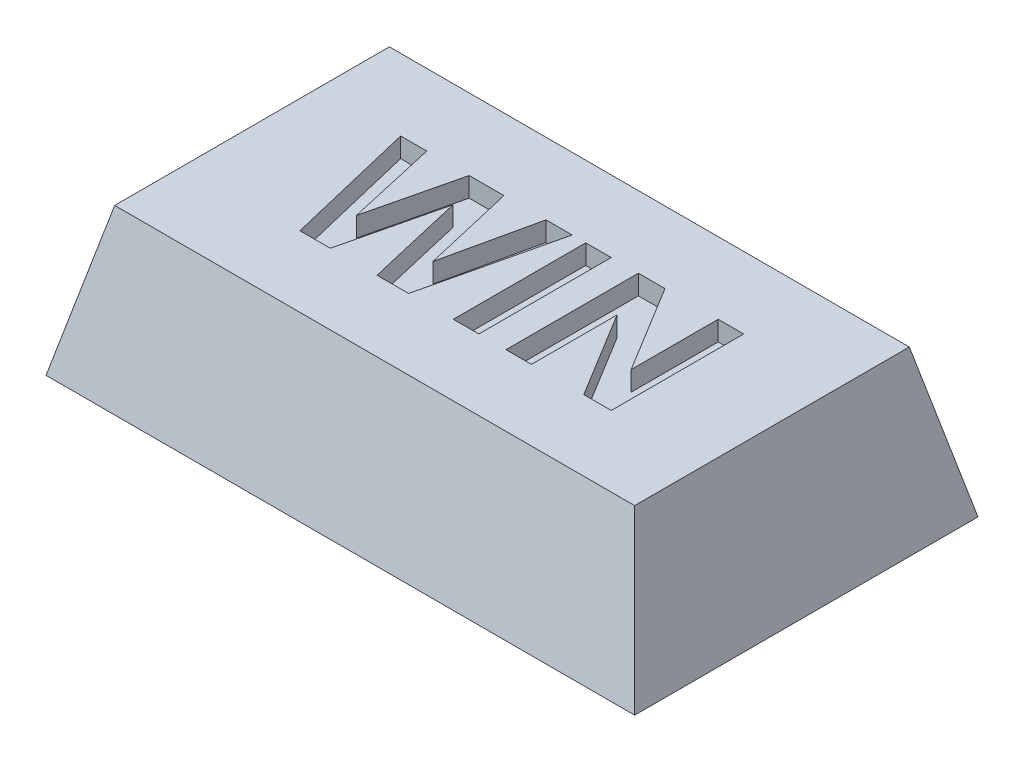
ISO-10303-21;
HEADER;
FILE_DESCRIPTION(('STEP AP214'),'2;1');
FILE_NAME('part.step','',(''),(''),'','','');
FILE_SCHEMA(('AUTOMOTIVE_DESIGN { 1 0 10303 214 1 1 1 1 }'));
ENDSEC;
DATA;
#1=APPLICATION_CONTEXT('core data for automotive mechanical design processes');
#2=APPLICATION_PROTOCOL_DEFINITION('international standard','automotive_design',2000,#1);
#3=PRODUCT_CONTEXT('',#1,'mechanical');
#4=PRODUCT('Part','Part','',(#3));
#5=PRODUCT_RELATED_PRODUCT_CATEGORY('part','',(#4));
#6=PRODUCT_DEFINITION_FORMATION('','',#4);
#7=PRODUCT_DEFINITION_CONTEXT('part definition',#1,'design');
#8=PRODUCT_DEFINITION('design','',#6,#7);
#9=PRODUCT_DEFINITION_SHAPE('','',#8);
#10=(LENGTH_UNIT() NAMED_UNIT(*) SI_UNIT(.MILLI.,.METRE.));
#11=(NAMED_UNIT(*) PLANE_ANGLE_UNIT() SI_UNIT($,.RADIAN.));
#12=(NAMED_UNIT(*) SI_UNIT($,.STERADIAN.) SOLID_ANGLE_UNIT());
#13=UNCERTAINTY_MEASURE_WITH_UNIT(LENGTH_MEASURE(1.E-05),#10,'distance_accuracy_value','');
#14=(GEOMETRIC_REPRESENTATION_CONTEXT(3) GLOBAL_UNCERTAINTY_ASSIGNED_CONTEXT((#13)) GLOBAL_UNIT_ASSIGNED_CONTEXT((#10,
#11,#12)) REPRESENTATION_CONTEXT('',''));
#15=CARTESIAN_POINT('',(0.,0.,0.));
#16=DIRECTION('',(0.,0.,1.));
#17=DIRECTION('',(1.,0.,0.));
#18=AXIS2_PLACEMENT_3D('',#15,#16,#17);
#19=CARTESIAN_POINT('',(0.,3.,0.));
#20=DIRECTION('',(0.,-1.,0.));
#21=DIRECTION('',(0.,0.,-1.));
#22=AXIS2_PLACEMENT_3D('',#19,#20,#21);
#23=PLANE('',#22);
#24=DIRECTION('',(-1.,0.,0.));
#25=VECTOR('',#24,1.);
#26=CARTESIAN_POINT('',(6.68149703487046,3.,-2.14148395066719));
#27=LINE('',#26,#25);
#28=CARTESIAN_POINT('',(6.68149703487046,3.,-2.14148395066719));
#29=VERTEX_POINT('',#28);
#30=CARTESIAN_POINT('',(6.16226626563969,3.,-2.14148395066719));
#31=VERTEX_POINT('',#30);
#32=EDGE_CURVE('E69',#29,#31,#27,.T.);
#33=ORIENTED_EDGE('',*,*,#32,.T.);
#34=DIRECTION('',(0.,0.,-1.));
#35=VECTOR('',#34,1.);
#36=CARTESIAN_POINT('',(6.16226626563969,3.,-2.14148395066719));
#37=LINE('',#36,#35);
#38=CARTESIAN_POINT('',(6.16226626563969,3.,-4.84148395066719));
#39=VERTEX_POINT('',#38);
#40=EDGE_CURVE('E309',#31,#39,#37,.T.);
#41=ORIENTED_EDGE('',*,*,#40,.T.);
#42=DIRECTION('',(1.,0.,0.));
#43=VECTOR('',#42,1.);
#44=CARTESIAN_POINT('',(6.16226626563969,3.,-4.84148395066719));
#45=LINE('',#44,#43);
#46=CARTESIAN_POINT('',(6.68149703487046,3.,-4.84148395066719));
#47=VERTEX_POINT('',#46);
#48=EDGE_CURVE('E304',#39,#47,#45,.T.);
#49=ORIENTED_EDGE('',*,*,#48,.T.);
#50=DIRECTION('',(0.,0.,1.));
#51=VECTOR('',#50,1.);
#52=CARTESIAN_POINT('',(6.68149703487046,3.,-4.84148395066719));
#53=LINE('',#52,#51);
#54=EDGE_CURVE('E300',#47,#29,#53,.T.);
#55=ORIENTED_EDGE('',*,*,#54,.T.);
#56=EDGE_LOOP('',(#33,#41,#49,#55));
#57=FACE_BOUND('',#56,.T.);
#58=DIRECTION('',(-1.,0.,0.));
#59=VECTOR('',#58,1.);
#60=CARTESIAN_POINT('',(12.,3.,-0.7));
#61=LINE('',#60,#59);
#62=CARTESIAN_POINT('',(11.3,3.,-0.7));
#63=VERTEX_POINT('',#62);
#64=CARTESIAN_POINT('',(0.7,3.,-0.7));
#65=VERTEX_POINT('',#64);
#66=EDGE_CURVE('E432',#63,#65,#61,.T.);
#67=ORIENTED_EDGE('',*,*,#66,.F.);
#68=DIRECTION('',(0.,0.,1.));
#69=VECTOR('',#68,1.);
#70=CARTESIAN_POINT('',(11.3,3.,-7.));
#71=LINE('',#70,#69);
#72=CARTESIAN_POINT('',(11.3,3.,-6.3));
#73=VERTEX_POINT('',#72);
#74=EDGE_CURVE('E444',#73,#63,#71,.T.);
#75=ORIENTED_EDGE('',*,*,#74,.F.);
#76=DIRECTION('',(-1.,0.,0.));
#77=VECTOR('',#76,1.);
#78=CARTESIAN_POINT('',(12.,3.,-6.3));
#79=LINE('',#78,#77);
#80=CARTESIAN_POINT('',(0.700000000000001,3.,-6.3));
#81=VERTEX_POINT('',#80);
#82=EDGE_CURVE('E430',#73,#81,#79,.T.);
#83=ORIENTED_EDGE('',*,*,#82,.T.);
#84=DIRECTION('',(0.,0.,1.));
#85=VECTOR('',#84,1.);
#86=CARTESIAN_POINT('',(0.7,3.,-7.));
#87=LINE('',#86,#85);
#88=EDGE_CURVE('E445',#81,#65,#87,.T.);
#89=ORIENTED_EDGE('',*,*,#88,.T.);
#90=EDGE_LOOP('',(#67,#75,#83,#89));
#91=FACE_BOUND('',#90,.T.);
#92=DIRECTION('',(-1.,0.,0.));
#93=VECTOR('',#92,1.);
#94=CARTESIAN_POINT('',(7.75457395794739,3.,-2.14148395066719));
#95=LINE('',#94,#93);
#96=CARTESIAN_POINT('',(7.75457395794739,3.,-2.14148395066719));
#97=VERTEX_POINT('',#96);
#98=CARTESIAN_POINT('',(7.23534318871662,3.,-2.14148395066719));
#99=VERTEX_POINT('',#98);
#100=EDGE_CURVE('E290',#97,#99,#95,.T.);
#101=ORIENTED_EDGE('',*,*,#100,.T.);
#102=DIRECTION('',(0.,0.,-1.));
#103=VECTOR('',#102,1.);
#104=CARTESIAN_POINT('',(7.23534318871662,3.,-2.14148395066719));
#105=LINE('',#104,#103);
#106=CARTESIAN_POINT('',(7.23534318871662,3.,-4.84148395066719));
#107=VERTEX_POINT('',#106);
#108=EDGE_CURVE('E392',#99,#107,#105,.T.);
#109=ORIENTED_EDGE('',*,*,#108,.T.);
#110=DIRECTION('',(1.,0.,0.));
#111=VECTOR('',#110,1.);
#112=CARTESIAN_POINT('',(7.23534318871662,3.,-4.84148395066719));
#113=LINE('',#112,#111);
#114=CARTESIAN_POINT('',(7.77783116948585,3.,-4.84148395066719));
#115=VERTEX_POINT('',#114);
#116=EDGE_CURVE('E388',#107,#115,#113,.T.);
#117=ORIENTED_EDGE('',*,*,#116,.T.);
#118=DIRECTION('',(0.521323795742144,0.,0.853358951434274));
#119=VECTOR('',#118,1.);
#120=CARTESIAN_POINT('',(7.77783116948585,3.,-4.84148395066719));
#121=LINE('',#120,#119);
#122=CARTESIAN_POINT('',(8.86226626563969,3.,-3.0663637583595));
#123=VERTEX_POINT('',#122);
#124=EDGE_CURVE('E384',#115,#123,#121,.T.);
#125=ORIENTED_EDGE('',*,*,#124,.T.);
#126=DIRECTION('',(0.,0.,-1.));
#127=VECTOR('',#126,1.);
#128=CARTESIAN_POINT('',(8.86226626563969,3.,-3.0663637583595));
#129=LINE('',#128,#127);
#130=CARTESIAN_POINT('',(8.86226626563969,3.,-4.84148395066719));
#131=VERTEX_POINT('',#130);
#132=EDGE_CURVE('E380',#123,#131,#129,.T.);
#133=ORIENTED_EDGE('',*,*,#132,.T.);
#134=DIRECTION('',(1.,0.,0.));
#135=VECTOR('',#134,1.);
#136=CARTESIAN_POINT('',(8.86226626563969,3.,-4.84148395066719));
#137=LINE('',#136,#135);
#138=CARTESIAN_POINT('',(9.38149703487046,3.,-4.84148395066719));
#139=VERTEX_POINT('',#138);
#140=EDGE_CURVE('E376',#131,#139,#137,.T.);
#141=ORIENTED_EDGE('',*,*,#140,.T.);
#142=DIRECTION('',(0.,0.,1.));
#143=VECTOR('',#142,1.);
#144=CARTESIAN_POINT('',(9.38149703487046,3.,-4.84148395066719));
#145=LINE('',#144,#143);
#146=CARTESIAN_POINT('',(9.38149703487046,3.,-2.14148395066719));
#147=VERTEX_POINT('',#146);
#148=EDGE_CURVE('E372',#139,#147,#145,.T.);
#149=ORIENTED_EDGE('',*,*,#148,.T.);
#150=DIRECTION('',(-1.,0.,0.));
#151=VECTOR('',#150,1.);
#152=CARTESIAN_POINT('',(9.38149703487046,3.,-2.14148395066719));
#153=LINE('',#152,#151);
#154=CARTESIAN_POINT('',(8.82224222717816,3.,-2.14148395066719));
#155=VERTEX_POINT('',#154);
#156=EDGE_CURVE('E368',#147,#155,#153,.T.);
#157=ORIENTED_EDGE('',*,*,#156,.T.);
#158=DIRECTION('',(-0.521471380338423,0.,-0.853268773299445));
#159=VECTOR('',#158,1.);
#160=CARTESIAN_POINT('',(8.82224222717816,3.,-2.14148395066719));
#161=LINE('',#160,#159);
#162=CARTESIAN_POINT('',(7.75457395794739,3.,-3.88847914297488));
#163=VERTEX_POINT('',#162);
#164=EDGE_CURVE('E363',#155,#163,#161,.T.);
#165=ORIENTED_EDGE('',*,*,#164,.T.);
#166=DIRECTION('',(0.,0.,1.));
#167=VECTOR('',#166,1.);
#168=CARTESIAN_POINT('',(7.75457395794739,3.,-3.88847914297488));
#169=LINE('',#168,#167);
#170=EDGE_CURVE('E359',#163,#97,#169,.T.);
#171=ORIENTED_EDGE('',*,*,#170,.T.);
#172=EDGE_LOOP('',(#101,#109,#117,#125,#133,#141,#149,#157,#165,#171));
#173=FACE_BOUND('',#172,.T.);
#174=DIRECTION('',(-1.,0.,0.));
#175=VECTOR('',#174,1.);
#176=CARTESIAN_POINT('',(3.65427347717815,3.,-2.14148395066719));
#177=LINE('',#176,#175);
#178=CARTESIAN_POINT('',(3.65427347717815,3.,-2.14148395066719));
#179=VERTEX_POINT('',#178);
#180=CARTESIAN_POINT('',(3.03552347717815,3.,-2.14148395066719));
#181=VERTEX_POINT('',#180);
#182=EDGE_CURVE('E61',#179,#181,#177,.T.);
#183=ORIENTED_EDGE('',*,*,#182,.T.);
#184=DIRECTION('',(-0.232805557977594,0.,-0.972523301610168));
#185=VECTOR('',#184,1.);
#186=CARTESIAN_POINT('',(3.03552347717815,3.,-2.14148395066719));
#187=LINE('',#186,#185);
#188=CARTESIAN_POINT('',(2.38918934256277,3.,-4.84148395066719));
#189=VERTEX_POINT('',#188);
#190=EDGE_CURVE('E272',#181,#189,#187,.T.);
#191=ORIENTED_EDGE('',*,*,#190,.T.);
#192=DIRECTION('',(1.,0.,0.));
#193=VECTOR('',#192,1.);
#194=CARTESIAN_POINT('',(2.38918934256277,3.,-4.84148395066719));
#195=LINE('',#194,#193);
#196=CARTESIAN_POINT('',(2.92140088102431,3.,-4.84148395066719));
#197=VERTEX_POINT('',#196);
#198=EDGE_CURVE('E506',#189,#197,#195,.T.);
#199=ORIENTED_EDGE('',*,*,#198,.T.);
#200=DIRECTION('',(0.220723550534741,0.,0.975336410803645));
#201=VECTOR('',#200,1.);
#202=CARTESIAN_POINT('',(2.92140088102431,3.,-4.84148395066719));
#203=LINE('',#202,#201);
#204=CARTESIAN_POINT('',(3.34111241948585,3.,-2.98685654682104));
#205=VERTEX_POINT('',#204);
#206=EDGE_CURVE('E514',#197,#205,#203,.T.);
#207=ORIENTED_EDGE('',*,*,#206,.T.);
#208=DIRECTION('',(0.232847309499336,0.,-0.972513306057516));
#209=VECTOR('',#208,1.);
#210=CARTESIAN_POINT('',(3.34111241948585,3.,-2.98685654682104));
#211=LINE('',#210,#209);
#212=CARTESIAN_POINT('',(3.78516290025508,3.,-4.84148395066719));
#213=VERTEX_POINT('',#212);
#214=EDGE_CURVE('E518',#205,#213,#211,.T.);
#215=ORIENTED_EDGE('',*,*,#214,.T.);
#216=DIRECTION('',(1.,0.,0.));
#217=VECTOR('',#216,1.);
#218=CARTESIAN_POINT('',(3.78516290025508,3.,-4.84148395066719));
#219=LINE('',#218,#217);
#220=CARTESIAN_POINT('',(4.49369655410123,3.,-4.84148395066719));
#221=VERTEX_POINT('',#220);
#222=EDGE_CURVE('E522',#213,#221,#219,.T.);
#223=ORIENTED_EDGE('',*,*,#222,.T.);
#224=DIRECTION('',(0.227061862326246,0.,0.973880336939265));
#225=VECTOR('',#224,1.);
#226=CARTESIAN_POINT('',(4.49369655410123,3.,-4.84148395066719));
#227=LINE('',#226,#225);
#228=CARTESIAN_POINT('',(4.93342011179354,3.,-2.95548635451334));
#229=VERTEX_POINT('',#228);
#230=EDGE_CURVE('E526',#221,#229,#227,.T.);
#231=ORIENTED_EDGE('',*,*,#230,.T.);
#232=DIRECTION('',(0.21669330416257,0.,-0.976239730768579));
#233=VECTOR('',#232,1.);
#234=CARTESIAN_POINT('',(4.93342011179354,3.,-2.95548635451334));
#235=LINE('',#234,#233);
#236=CARTESIAN_POINT('',(5.35204991948585,3.,-4.84148395066719));
#237=VERTEX_POINT('',#236);
#238=EDGE_CURVE('E530',#229,#237,#235,.T.);
#239=ORIENTED_EDGE('',*,*,#238,.T.);
#240=DIRECTION('',(1.,0.,0.));
#241=VECTOR('',#240,1.);
#242=CARTESIAN_POINT('',(5.35204991948585,3.,-4.84148395066719));
#243=LINE('',#242,#241);
#244=CARTESIAN_POINT('',(5.88534318871662,3.,-4.84148395066719));
#245=VERTEX_POINT('',#244);
#246=EDGE_CURVE('E534',#237,#245,#243,.T.);
#247=ORIENTED_EDGE('',*,*,#246,.T.);
#248=DIRECTION('',(-0.228745850379276,0.,0.973486176550167));
#249=VECTOR('',#248,1.);
#250=CARTESIAN_POINT('',(5.88534318871662,3.,-4.84148395066719));
#251=LINE('',#250,#249);
#252=CARTESIAN_POINT('',(5.25090809256277,3.,-2.14148395066719));
#253=VERTEX_POINT('',#252);
#254=EDGE_CURVE('E538',#245,#253,#251,.T.);
#255=ORIENTED_EDGE('',*,*,#254,.T.);
#256=DIRECTION('',(-1.,0.,0.));
#257=VECTOR('',#256,1.);
#258=CARTESIAN_POINT('',(5.25090809256277,3.,-2.14148395066719));
#259=LINE('',#258,#257);
#260=CARTESIAN_POINT('',(4.60781915025508,3.,-2.14148395066719));
#261=VERTEX_POINT('',#260);
#262=EDGE_CURVE('E542',#253,#261,#259,.T.);
#263=ORIENTED_EDGE('',*,*,#262,.T.);
#264=DIRECTION('',(-0.227031625408111,0.,-0.973887386233414));
#265=VECTOR('',#264,1.);
#266=CARTESIAN_POINT('',(4.60781915025508,3.,-2.14148395066719));
#267=LINE('',#266,#265);
#268=CARTESIAN_POINT('',(4.13726626563969,3.,-4.15999356605181));
#269=VERTEX_POINT('',#268);
#270=EDGE_CURVE('E546',#261,#269,#267,.T.);
#271=ORIENTED_EDGE('',*,*,#270,.T.);
#272=DIRECTION('',(-0.232712537268101,0.,0.972545564484381));
#273=VECTOR('',#272,1.);
#274=CARTESIAN_POINT('',(4.13726626563969,3.,-4.15999356605181));
#275=LINE('',#274,#273);
#276=EDGE_CURVE('E268',#269,#179,#275,.T.);
#277=ORIENTED_EDGE('',*,*,#276,.T.);
#278=EDGE_LOOP('',(#183,#191,#199,#207,#215,#223,#231,#239,#247,#255,#263,#271,#277));
#279=FACE_BOUND('',#278,.T.);
#280=ADVANCED_FACE('F43',(#57,#91,#173,#279),#23,.F.);
#281=CARTESIAN_POINT('',(12.,0.,-7.));
#282=DIRECTION('',(-0.973841209741793,-0.227229615606418,0.));
#283=DIRECTION('',(0.227229615606418,-0.973841209741793,0.));
#284=AXIS2_PLACEMENT_3D('',#281,#282,#283);
#285=PLANE('',#284);
#286=DIRECTION('',(-0.221581128241521,0.949633406749378,-0.221581128241521));
#287=VECTOR('',#286,1.);
#288=CARTESIAN_POINT('',(11.6563126252505,1.47294589178357,-0.3436873747495));
#289=LINE('',#288,#287);
#290=CARTESIAN_POINT('',(12.,0.,0.));
#291=VERTEX_POINT('',#290);
#292=EDGE_CURVE('E441',#291,#63,#289,.T.);
#293=ORIENTED_EDGE('',*,*,#292,.F.);
#294=DIRECTION('',(0.,0.,-1.));
#295=VECTOR('',#294,1.);
#296=CARTESIAN_POINT('',(12.,0.,0.));
#297=LINE('',#296,#295);
#298=CARTESIAN_POINT('',(12.,0.,-7.));
#299=VERTEX_POINT('',#298);
#300=EDGE_CURVE('E453',#291,#299,#297,.T.);
#301=ORIENTED_EDGE('',*,*,#300,.T.);
#302=DIRECTION('',(0.221581128241521,-0.949633406749378,-0.221581128241521));
#303=VECTOR('',#302,1.);
#304=CARTESIAN_POINT('',(12.,0.,-7.));
#305=LINE('',#304,#303);
#306=EDGE_CURVE('E435',#73,#299,#305,.T.);
#307=ORIENTED_EDGE('',*,*,#306,.F.);
#308=ORIENTED_EDGE('',*,*,#74,.T.);
#309=EDGE_LOOP('',(#293,#301,#307,#308));
#310=FACE_BOUND('',#309,.T.);
#311=ADVANCED_FACE('F484',(#310),#285,.F.);
#312=CARTESIAN_POINT('',(0.,0.,-7.));
#313=DIRECTION('',(0.973841209741793,-0.227229615606418,0.));
#314=DIRECTION('',(0.227229615606418,0.973841209741793,0.));
#315=AXIS2_PLACEMENT_3D('',#312,#313,#314);
#316=PLANE('',#315);
#317=DIRECTION('',(-0.221581128241521,-0.949633406749378,0.221581128241521));
#318=VECTOR('',#317,1.);
#319=CARTESIAN_POINT('',(0.343687374749499,1.47294589178357,-0.3436873747495));
#320=LINE('',#319,#318);
#321=CARTESIAN_POINT('',(-6.E-06,0.,0.));
#322=VERTEX_POINT('',#321);
#323=EDGE_CURVE('E11',#65,#322,#320,.T.);
#324=ORIENTED_EDGE('',*,*,#323,.F.);
#325=ORIENTED_EDGE('',*,*,#88,.F.);
#326=DIRECTION('',(0.221581128241521,0.949633406749378,0.221581128241521));
#327=VECTOR('',#326,1.);
#328=CARTESIAN_POINT('',(0.,0.,-7.));
#329=LINE('',#328,#327);
#330=CARTESIAN_POINT('',(0.,0.,-7.));
#331=VERTEX_POINT('',#330);
#332=EDGE_CURVE('E53',#331,#81,#329,.T.);
#333=ORIENTED_EDGE('',*,*,#332,.F.);
#334=DIRECTION('',(0.,0.,1.));
#335=VECTOR('',#334,1.);
#336=CARTESIAN_POINT('',(0.,0.,0.));
#337=LINE('',#336,#335);
#338=EDGE_CURVE('E449',#331,#322,#337,.T.);
#339=ORIENTED_EDGE('',*,*,#338,.T.);
#340=EDGE_LOOP('',(#324,#325,#333,#339));
#341=FACE_BOUND('',#340,.T.);
#342=ADVANCED_FACE('F493',(#341),#316,.F.);
#343=CARTESIAN_POINT('',(0.,0.,0.));
#344=DIRECTION('',(0.,-1.,0.));
#345=DIRECTION('',(0.,0.,-1.));
#346=AXIS2_PLACEMENT_3D('',#343,#344,#345);
#347=PLANE('',#346);
#348=CARTESIAN_POINT('',(6.,0.,-3.5));
#349=DIRECTION('',(0.,-1.,0.));
#350=DIRECTION('',(0.,0.,-1.));
#351=AXIS2_PLACEMENT_3D('',#348,#349,#350);
#352=CIRCLE('',#351,1.8);
#353=CARTESIAN_POINT('',(6.,0.,-5.3));
#354=VERTEX_POINT('',#353);
#355=EDGE_CURVE('E274',#354,#354,#352,.T.);
#356=ORIENTED_EDGE('',*,*,#355,.F.);
#357=EDGE_LOOP('',(#356));
#358=FACE_BOUND('',#357,.T.);
#359=ORIENTED_EDGE('',*,*,#338,.F.);
#360=DIRECTION('',(-1.,0.,0.));
#361=VECTOR('',#360,1.);
#362=CARTESIAN_POINT('',(0.,0.,-7.));
#363=LINE('',#362,#361);
#364=EDGE_CURVE('E457',#299,#331,#363,.T.);
#365=ORIENTED_EDGE('',*,*,#364,.F.);
#366=ORIENTED_EDGE('',*,*,#300,.F.);
#367=DIRECTION('',(1.,0.,0.));
#368=VECTOR('',#367,1.);
#369=CARTESIAN_POINT('',(0.,0.,0.));
#370=LINE('',#369,#368);
#371=EDGE_CURVE('E458',#322,#291,#370,.T.);
#372=ORIENTED_EDGE('',*,*,#371,.F.);
#373=EDGE_LOOP('',(#359,#365,#366,#372));
#374=FACE_BOUND('',#373,.T.);
#375=ADVANCED_FACE('F45',(#358,#374),#347,.T.);
#376=CARTESIAN_POINT('',(12.,3.,-6.3));
#377=DIRECTION('',(0.,0.227229615606418,-0.973841209741793));
#378=DIRECTION('',(0.,0.973841209741793,0.227229615606418));
#379=AXIS2_PLACEMENT_3D('',#376,#377,#378);
#380=PLANE('',#379);
#381=ORIENTED_EDGE('',*,*,#306,.T.);
#382=ORIENTED_EDGE('',*,*,#364,.T.);
#383=ORIENTED_EDGE('',*,*,#332,.T.);
#384=ORIENTED_EDGE('',*,*,#82,.F.);
#385=EDGE_LOOP('',(#381,#382,#383,#384));
#386=FACE_BOUND('',#385,.T.);
#387=ADVANCED_FACE('F490',(#386),#380,.T.);
#388=CARTESIAN_POINT('',(12.,0.,0.));
#389=DIRECTION('',(0.,0.227229615606418,0.973841209741793));
#390=DIRECTION('',(0.,-0.973841209741793,0.227229615606418));
#391=AXIS2_PLACEMENT_3D('',#388,#389,#390);
#392=PLANE('',#391);
#393=ORIENTED_EDGE('',*,*,#292,.T.);
#394=ORIENTED_EDGE('',*,*,#66,.T.);
#395=ORIENTED_EDGE('',*,*,#323,.T.);
#396=ORIENTED_EDGE('',*,*,#371,.T.);
#397=EDGE_LOOP('',(#393,#394,#395,#396));
#398=FACE_BOUND('',#397,.T.);
#399=ADVANCED_FACE('F477',(#398),#392,.T.);
#400=CARTESIAN_POINT('',(6.,0.8,-3.5));
#401=DIRECTION('',(0.,-1.,0.));
#402=DIRECTION('',(0.,0.,-1.));
#403=AXIS2_PLACEMENT_3D('',#400,#401,#402);
#404=CYLINDRICAL_SURFACE('',#403,1.8);
#405=CARTESIAN_POINT('',(6.,0.8,-3.5));
#406=DIRECTION('',(0.,-1.,0.));
#407=DIRECTION('',(0.,0.,-1.));
#408=AXIS2_PLACEMENT_3D('',#405,#406,#407);
#409=CIRCLE('',#408,1.8);
#410=CARTESIAN_POINT('',(6.,0.8,-5.3));
#411=VERTEX_POINT('',#410);
#412=EDGE_CURVE('E280',#411,#411,#409,.T.);
#413=ORIENTED_EDGE('',*,*,#412,.F.);
#414=EDGE_LOOP('',(#413));
#415=FACE_BOUND('',#414,.T.);
#416=ORIENTED_EDGE('',*,*,#355,.T.);
#417=EDGE_LOOP('',(#416));
#418=FACE_BOUND('',#417,.T.);
#419=ADVANCED_FACE('F756',(#415,#418),#404,.F.);
#420=CARTESIAN_POINT('',(6.,0.8,-3.5));
#421=DIRECTION('',(0.,-1.,0.));
#422=DIRECTION('',(0.,0.,-1.));
#423=AXIS2_PLACEMENT_3D('',#420,#421,#422);
#424=PLANE('',#423);
#425=ORIENTED_EDGE('',*,*,#412,.T.);
#426=EDGE_LOOP('',(#425));
#427=FACE_BOUND('',#426,.T.);
#428=ADVANCED_FACE('F714',(#427),#424,.T.);
#429=CARTESIAN_POINT('',(7.75457395794739,2.6,-2.14148395066719));
#430=DIRECTION('',(0.,0.,-1.));
#431=DIRECTION('',(-1.,0.,0.));
#432=AXIS2_PLACEMENT_3D('',#429,#430,#431);
#433=PLANE('',#432);
#434=ORIENTED_EDGE('',*,*,#100,.F.);
#435=DIRECTION('',(0.,1.,0.));
#436=VECTOR('',#435,1.);
#437=CARTESIAN_POINT('',(7.75457395794739,2.6,-2.14148395066719));
#438=LINE('',#437,#436);
#439=CARTESIAN_POINT('',(7.75457395794739,2.6,-2.14148395066719));
#440=VERTEX_POINT('',#439);
#441=EDGE_CURVE('E354',#440,#97,#438,.T.);
#442=ORIENTED_EDGE('',*,*,#441,.F.);
#443=DIRECTION('',(-1.,0.,0.));
#444=VECTOR('',#443,1.);
#445=CARTESIAN_POINT('',(7.75457395794739,2.6,-2.14148395066719));
#446=LINE('',#445,#444);
#447=CARTESIAN_POINT('',(7.23534318871662,2.6,-2.14148395066719));
#448=VERTEX_POINT('',#447);
#449=EDGE_CURVE('E364',#440,#448,#446,.T.);
#450=ORIENTED_EDGE('',*,*,#449,.T.);
#451=DIRECTION('',(0.,1.,0.));
#452=VECTOR('',#451,1.);
#453=CARTESIAN_POINT('',(7.23534318871662,2.6,-2.14148395066719));
#454=LINE('',#453,#452);
#455=EDGE_CURVE('E326',#448,#99,#454,.T.);
#456=ORIENTED_EDGE('',*,*,#455,.T.);
#457=EDGE_LOOP('',(#434,#442,#450,#456));
#458=FACE_BOUND('',#457,.T.);
#459=ADVANCED_FACE('F710',(#458),#433,.T.);
#460=CARTESIAN_POINT('',(7.23534318871662,2.6,-2.14148395066719));
#461=DIRECTION('',(1.,0.,0.));
#462=DIRECTION('',(0.,0.,-1.));
#463=AXIS2_PLACEMENT_3D('',#460,#461,#462);
#464=PLANE('',#463);
#465=ORIENTED_EDGE('',*,*,#108,.F.);
#466=ORIENTED_EDGE('',*,*,#455,.F.);
#467=DIRECTION('',(0.,0.,-1.));
#468=VECTOR('',#467,1.);
#469=CARTESIAN_POINT('',(7.23534318871662,2.6,-2.14148395066719));
#470=LINE('',#469,#468);
#471=CARTESIAN_POINT('',(7.23534318871662,2.6,-4.84148395066719));
#472=VERTEX_POINT('',#471);
#473=EDGE_CURVE('E422',#448,#472,#470,.T.);
#474=ORIENTED_EDGE('',*,*,#473,.T.);
#475=DIRECTION('',(0.,1.,0.));
#476=VECTOR('',#475,1.);
#477=CARTESIAN_POINT('',(7.23534318871662,2.6,-4.84148395066719));
#478=LINE('',#477,#476);
#479=EDGE_CURVE('E330',#472,#107,#478,.T.);
#480=ORIENTED_EDGE('',*,*,#479,.T.);
#481=EDGE_LOOP('',(#465,#466,#474,#480));
#482=FACE_BOUND('',#481,.T.);
#483=ADVANCED_FACE('F713',(#482),#464,.T.);
#484=CARTESIAN_POINT('',(7.23534318871662,2.6,-4.84148395066719));
#485=DIRECTION('',(0.,0.,1.));
#486=DIRECTION('',(1.,0.,0.));
#487=AXIS2_PLACEMENT_3D('',#484,#485,#486);
#488=PLANE('',#487);
#489=ORIENTED_EDGE('',*,*,#116,.F.);
#490=ORIENTED_EDGE('',*,*,#479,.F.);
#491=DIRECTION('',(1.,0.,0.));
#492=VECTOR('',#491,1.);
#493=CARTESIAN_POINT('',(7.23534318871662,2.6,-4.84148395066719));
#494=LINE('',#493,#492);
#495=CARTESIAN_POINT('',(7.77783116948585,2.6,-4.84148395066719));
#496=VERTEX_POINT('',#495);
#497=EDGE_CURVE('E419',#472,#496,#494,.T.);
#498=ORIENTED_EDGE('',*,*,#497,.T.);
#499=DIRECTION('',(0.,1.,0.));
#500=VECTOR('',#499,1.);
#501=CARTESIAN_POINT('',(7.77783116948585,2.6,-4.84148395066719));
#502=LINE('',#501,#500);
#503=EDGE_CURVE('E333',#496,#115,#502,.T.);
#504=ORIENTED_EDGE('',*,*,#503,.T.);
#505=EDGE_LOOP('',(#489,#490,#498,#504));
#506=FACE_BOUND('',#505,.T.);
#507=ADVANCED_FACE('F718',(#506),#488,.T.);
#508=CARTESIAN_POINT('',(7.77783116948585,2.6,-4.84148395066719));
#509=DIRECTION('',(-0.853358951434274,0.,0.521323795742145));
#510=DIRECTION('',(0.521323795742145,0.,0.853358951434274));
#511=AXIS2_PLACEMENT_3D('',#508,#509,#510);
#512=PLANE('',#511);
#513=ORIENTED_EDGE('',*,*,#124,.F.);
#514=ORIENTED_EDGE('',*,*,#503,.F.);
#515=DIRECTION('',(0.521323795742144,0.,0.853358951434274));
#516=VECTOR('',#515,1.);
#517=CARTESIAN_POINT('',(7.77783116948585,2.6,-4.84148395066719));
#518=LINE('',#517,#516);
#519=CARTESIAN_POINT('',(8.86226626563969,2.6,-3.0663637583595));
#520=VERTEX_POINT('',#519);
#521=EDGE_CURVE('E416',#496,#520,#518,.T.);
#522=ORIENTED_EDGE('',*,*,#521,.T.);
#523=DIRECTION('',(0.,1.,0.));
#524=VECTOR('',#523,1.);
#525=CARTESIAN_POINT('',(8.86226626563969,2.6,-3.0663637583595));
#526=LINE('',#525,#524);
#527=EDGE_CURVE('E336',#520,#123,#526,.T.);
#528=ORIENTED_EDGE('',*,*,#527,.T.);
#529=EDGE_LOOP('',(#513,#514,#522,#528));
#530=FACE_BOUND('',#529,.T.);
#531=ADVANCED_FACE('F722',(#530),#512,.T.);
#532=CARTESIAN_POINT('',(8.86226626563969,2.6,-3.0663637583595));
#533=DIRECTION('',(1.,0.,0.));
#534=DIRECTION('',(0.,0.,-1.));
#535=AXIS2_PLACEMENT_3D('',#532,#533,#534);
#536=PLANE('',#535);
#537=ORIENTED_EDGE('',*,*,#132,.F.);
#538=ORIENTED_EDGE('',*,*,#527,.F.);
#539=DIRECTION('',(0.,0.,-1.));
#540=VECTOR('',#539,1.);
#541=CARTESIAN_POINT('',(8.86226626563969,2.6,-3.0663637583595));
#542=LINE('',#541,#540);
#543=CARTESIAN_POINT('',(8.86226626563969,2.6,-4.84148395066719));
#544=VERTEX_POINT('',#543);
#545=EDGE_CURVE('E413',#520,#544,#542,.T.);
#546=ORIENTED_EDGE('',*,*,#545,.T.);
#547=DIRECTION('',(0.,1.,0.));
#548=VECTOR('',#547,1.);
#549=CARTESIAN_POINT('',(8.86226626563969,2.6,-4.84148395066719));
#550=LINE('',#549,#548);
#551=EDGE_CURVE('E339',#544,#131,#550,.T.);
#552=ORIENTED_EDGE('',*,*,#551,.T.);
#553=EDGE_LOOP('',(#537,#538,#546,#552));
#554=FACE_BOUND('',#553,.T.);
#555=ADVANCED_FACE('F726',(#554),#536,.T.);
#556=CARTESIAN_POINT('',(8.86226626563969,2.6,-4.84148395066719));
#557=DIRECTION('',(0.,0.,1.));
#558=DIRECTION('',(1.,0.,0.));
#559=AXIS2_PLACEMENT_3D('',#556,#557,#558);
#560=PLANE('',#559);
#561=ORIENTED_EDGE('',*,*,#140,.F.);
#562=ORIENTED_EDGE('',*,*,#551,.F.);
#563=DIRECTION('',(1.,0.,0.));
#564=VECTOR('',#563,1.);
#565=CARTESIAN_POINT('',(8.86226626563969,2.6,-4.84148395066719));
#566=LINE('',#565,#564);
#567=CARTESIAN_POINT('',(9.38149703487046,2.6,-4.84148395066719));
#568=VERTEX_POINT('',#567);
#569=EDGE_CURVE('E410',#544,#568,#566,.T.);
#570=ORIENTED_EDGE('',*,*,#569,.T.);
#571=DIRECTION('',(0.,1.,0.));
#572=VECTOR('',#571,1.);
#573=CARTESIAN_POINT('',(9.38149703487046,2.6,-4.84148395066719));
#574=LINE('',#573,#572);
#575=EDGE_CURVE('E342',#568,#139,#574,.T.);
#576=ORIENTED_EDGE('',*,*,#575,.T.);
#577=EDGE_LOOP('',(#561,#562,#570,#576));
#578=FACE_BOUND('',#577,.T.);
#579=ADVANCED_FACE('F730',(#578),#560,.T.);
#580=CARTESIAN_POINT('',(9.38149703487046,2.6,-4.84148395066719));
#581=DIRECTION('',(-1.,0.,0.));
#582=DIRECTION('',(0.,0.,1.));
#583=AXIS2_PLACEMENT_3D('',#580,#581,#582);
#584=PLANE('',#583);
#585=ORIENTED_EDGE('',*,*,#148,.F.);
#586=ORIENTED_EDGE('',*,*,#575,.F.);
#587=DIRECTION('',(0.,0.,1.));
#588=VECTOR('',#587,1.);
#589=CARTESIAN_POINT('',(9.38149703487046,2.6,-4.84148395066719));
#590=LINE('',#589,#588);
#591=CARTESIAN_POINT('',(9.38149703487046,2.6,-2.14148395066719));
#592=VERTEX_POINT('',#591);
#593=EDGE_CURVE('E407',#568,#592,#590,.T.);
#594=ORIENTED_EDGE('',*,*,#593,.T.);
#595=DIRECTION('',(0.,1.,0.));
#596=VECTOR('',#595,1.);
#597=CARTESIAN_POINT('',(9.38149703487046,2.6,-2.14148395066719));
#598=LINE('',#597,#596);
#599=EDGE_CURVE('E345',#592,#147,#598,.T.);
#600=ORIENTED_EDGE('',*,*,#599,.T.);
#601=EDGE_LOOP('',(#585,#586,#594,#600));
#602=FACE_BOUND('',#601,.T.);
#603=ADVANCED_FACE('F734',(#602),#584,.T.);
#604=CARTESIAN_POINT('',(9.38149703487046,2.6,-2.14148395066719));
#605=DIRECTION('',(0.,0.,-1.));
#606=DIRECTION('',(-1.,0.,0.));
#607=AXIS2_PLACEMENT_3D('',#604,#605,#606);
#608=PLANE('',#607);
#609=ORIENTED_EDGE('',*,*,#156,.F.);
#610=ORIENTED_EDGE('',*,*,#599,.F.);
#611=DIRECTION('',(-1.,0.,0.));
#612=VECTOR('',#611,1.);
#613=CARTESIAN_POINT('',(9.38149703487046,2.6,-2.14148395066719));
#614=LINE('',#613,#612);
#615=CARTESIAN_POINT('',(8.82224222717816,2.6,-2.14148395066719));
#616=VERTEX_POINT('',#615);
#617=EDGE_CURVE('E404',#592,#616,#614,.T.);
#618=ORIENTED_EDGE('',*,*,#617,.T.);
#619=DIRECTION('',(0.,1.,0.));
#620=VECTOR('',#619,1.);
#621=CARTESIAN_POINT('',(8.82224222717816,2.6,-2.14148395066719));
#622=LINE('',#621,#620);
#623=EDGE_CURVE('E348',#616,#155,#622,.T.);
#624=ORIENTED_EDGE('',*,*,#623,.T.);
#625=EDGE_LOOP('',(#609,#610,#618,#624));
#626=FACE_BOUND('',#625,.T.);
#627=ADVANCED_FACE('F738',(#626),#608,.T.);
#628=CARTESIAN_POINT('',(8.82224222717816,2.6,-2.14148395066719));
#629=DIRECTION('',(0.853268773299445,0.,-0.521471380338423));
#630=DIRECTION('',(-0.521471380338423,0.,-0.853268773299445));
#631=AXIS2_PLACEMENT_3D('',#628,#629,#630);
#632=PLANE('',#631);
#633=ORIENTED_EDGE('',*,*,#164,.F.);
#634=ORIENTED_EDGE('',*,*,#623,.F.);
#635=DIRECTION('',(-0.521471380338423,0.,-0.853268773299445));
#636=VECTOR('',#635,1.);
#637=CARTESIAN_POINT('',(8.82224222717816,2.6,-2.14148395066719));
#638=LINE('',#637,#636);
#639=CARTESIAN_POINT('',(7.75457395794739,2.6,-3.88847914297488));
#640=VERTEX_POINT('',#639);
#641=EDGE_CURVE('E401',#616,#640,#638,.T.);
#642=ORIENTED_EDGE('',*,*,#641,.T.);
#643=DIRECTION('',(0.,1.,0.));
#644=VECTOR('',#643,1.);
#645=CARTESIAN_POINT('',(7.75457395794739,2.6,-3.88847914297488));
#646=LINE('',#645,#644);
#647=EDGE_CURVE('E351',#640,#163,#646,.T.);
#648=ORIENTED_EDGE('',*,*,#647,.T.);
#649=EDGE_LOOP('',(#633,#634,#642,#648));
#650=FACE_BOUND('',#649,.T.);
#651=ADVANCED_FACE('F742',(#650),#632,.T.);
#652=CARTESIAN_POINT('',(7.75457395794739,2.6,-3.88847914297488));
#653=DIRECTION('',(-1.,0.,0.));
#654=DIRECTION('',(0.,0.,1.));
#655=AXIS2_PLACEMENT_3D('',#652,#653,#654);
#656=PLANE('',#655);
#657=ORIENTED_EDGE('',*,*,#170,.F.);
#658=ORIENTED_EDGE('',*,*,#647,.F.);
#659=DIRECTION('',(0.,0.,1.));
#660=VECTOR('',#659,1.);
#661=CARTESIAN_POINT('',(7.75457395794739,2.6,-3.88847914297488));
#662=LINE('',#661,#660);
#663=EDGE_CURVE('E358',#640,#440,#662,.T.);
#664=ORIENTED_EDGE('',*,*,#663,.T.);
#665=ORIENTED_EDGE('',*,*,#441,.T.);
#666=EDGE_LOOP('',(#657,#658,#664,#665));
#667=FACE_BOUND('',#666,.T.);
#668=ADVANCED_FACE('F746',(#667),#656,.T.);
#669=CARTESIAN_POINT('',(0.,2.6,0.));
#670=DIRECTION('',(0.,-1.,0.));
#671=DIRECTION('',(0.,0.,-1.));
#672=AXIS2_PLACEMENT_3D('',#669,#670,#671);
#673=PLANE('',#672);
#674=ORIENTED_EDGE('',*,*,#449,.F.);
#675=ORIENTED_EDGE('',*,*,#663,.F.);
#676=ORIENTED_EDGE('',*,*,#641,.F.);
#677=ORIENTED_EDGE('',*,*,#617,.F.);
#678=ORIENTED_EDGE('',*,*,#593,.F.);
#679=ORIENTED_EDGE('',*,*,#569,.F.);
#680=ORIENTED_EDGE('',*,*,#545,.F.);
#681=ORIENTED_EDGE('',*,*,#521,.F.);
#682=ORIENTED_EDGE('',*,*,#497,.F.);
#683=ORIENTED_EDGE('',*,*,#473,.F.);
#684=EDGE_LOOP('',(#674,#675,#676,#677,#678,#679,#680,#681,#682,#683));
#685=FACE_BOUND('',#684,.T.);
#686=ADVANCED_FACE('F695',(#685),#673,.F.);
#687=CARTESIAN_POINT('',(6.68149703487046,2.6,-2.14148395066719));
#688=DIRECTION('',(0.,0.,-1.));
#689=DIRECTION('',(-1.,0.,0.));
#690=AXIS2_PLACEMENT_3D('',#687,#688,#689);
#691=PLANE('',#690);
#692=ORIENTED_EDGE('',*,*,#32,.F.);
#693=DIRECTION('',(0.,1.,0.));
#694=VECTOR('',#693,1.);
#695=CARTESIAN_POINT('',(6.68149703487046,2.6,-2.14148395066719));
#696=LINE('',#695,#694);
#697=CARTESIAN_POINT('',(6.68149703487046,2.6,-2.14148395066719));
#698=VERTEX_POINT('',#697);
#699=EDGE_CURVE('E296',#698,#29,#696,.T.);
#700=ORIENTED_EDGE('',*,*,#699,.F.);
#701=DIRECTION('',(-1.,0.,0.));
#702=VECTOR('',#701,1.);
#703=CARTESIAN_POINT('',(6.68149703487046,2.6,-2.14148395066719));
#704=LINE('',#703,#702);
#705=CARTESIAN_POINT('',(6.16226626563969,2.6,-2.14148395066719));
#706=VERTEX_POINT('',#705);
#707=EDGE_CURVE('E305',#698,#706,#704,.T.);
#708=ORIENTED_EDGE('',*,*,#707,.T.);
#709=DIRECTION('',(0.,1.,0.));
#710=VECTOR('',#709,1.);
#711=CARTESIAN_POINT('',(6.16226626563969,2.6,-2.14148395066719));
#712=LINE('',#711,#710);
#713=EDGE_CURVE('E286',#706,#31,#712,.T.);
#714=ORIENTED_EDGE('',*,*,#713,.T.);
#715=EDGE_LOOP('',(#692,#700,#708,#714));
#716=FACE_BOUND('',#715,.T.);
#717=ADVANCED_FACE('F691',(#716),#691,.T.);
#718=CARTESIAN_POINT('',(6.16226626563969,2.6,-2.14148395066719));
#719=DIRECTION('',(1.,0.,0.));
#720=DIRECTION('',(0.,0.,-1.));
#721=AXIS2_PLACEMENT_3D('',#718,#719,#720);
#722=PLANE('',#721);
#723=ORIENTED_EDGE('',*,*,#40,.F.);
#724=ORIENTED_EDGE('',*,*,#713,.F.);
#725=DIRECTION('',(0.,0.,-1.));
#726=VECTOR('',#725,1.);
#727=CARTESIAN_POINT('',(6.16226626563969,2.6,-2.14148395066719));
#728=LINE('',#727,#726);
#729=CARTESIAN_POINT('',(6.16226626563969,2.6,-4.84148395066719));
#730=VERTEX_POINT('',#729);
#731=EDGE_CURVE('E320',#706,#730,#728,.T.);
#732=ORIENTED_EDGE('',*,*,#731,.T.);
#733=DIRECTION('',(0.,1.,0.));
#734=VECTOR('',#733,1.);
#735=CARTESIAN_POINT('',(6.16226626563969,2.6,-4.84148395066719));
#736=LINE('',#735,#734);
#737=EDGE_CURVE('E289',#730,#39,#736,.T.);
#738=ORIENTED_EDGE('',*,*,#737,.T.);
#739=EDGE_LOOP('',(#723,#724,#732,#738));
#740=FACE_BOUND('',#739,.T.);
#741=ADVANCED_FACE('F694',(#740),#722,.T.);
#742=CARTESIAN_POINT('',(6.16226626563969,2.6,-4.84148395066719));
#743=DIRECTION('',(0.,0.,1.));
#744=DIRECTION('',(1.,0.,0.));
#745=AXIS2_PLACEMENT_3D('',#742,#743,#744);
#746=PLANE('',#745);
#747=ORIENTED_EDGE('',*,*,#48,.F.);
#748=ORIENTED_EDGE('',*,*,#737,.F.);
#749=DIRECTION('',(1.,0.,0.));
#750=VECTOR('',#749,1.);
#751=CARTESIAN_POINT('',(6.16226626563969,2.6,-4.84148395066719));
#752=LINE('',#751,#750);
#753=CARTESIAN_POINT('',(6.68149703487046,2.6,-4.84148395066719));
#754=VERTEX_POINT('',#753);
#755=EDGE_CURVE('E317',#730,#754,#752,.T.);
#756=ORIENTED_EDGE('',*,*,#755,.T.);
#757=DIRECTION('',(0.,1.,0.));
#758=VECTOR('',#757,1.);
#759=CARTESIAN_POINT('',(6.68149703487046,2.6,-4.84148395066719));
#760=LINE('',#759,#758);
#761=EDGE_CURVE('E293',#754,#47,#760,.T.);
#762=ORIENTED_EDGE('',*,*,#761,.T.);
#763=EDGE_LOOP('',(#747,#748,#756,#762));
#764=FACE_BOUND('',#763,.T.);
#765=ADVANCED_FACE('F698',(#764),#746,.T.);
#766=CARTESIAN_POINT('',(6.68149703487046,2.6,-4.84148395066719));
#767=DIRECTION('',(-1.,0.,0.));
#768=DIRECTION('',(0.,0.,1.));
#769=AXIS2_PLACEMENT_3D('',#766,#767,#768);
#770=PLANE('',#769);
#771=ORIENTED_EDGE('',*,*,#54,.F.);
#772=ORIENTED_EDGE('',*,*,#761,.F.);
#773=DIRECTION('',(0.,0.,1.));
#774=VECTOR('',#773,1.);
#775=CARTESIAN_POINT('',(6.68149703487046,2.6,-4.84148395066719));
#776=LINE('',#775,#774);
#777=EDGE_CURVE('E299',#754,#698,#776,.T.);
#778=ORIENTED_EDGE('',*,*,#777,.T.);
#779=ORIENTED_EDGE('',*,*,#699,.T.);
#780=EDGE_LOOP('',(#771,#772,#778,#779));
#781=FACE_BOUND('',#780,.T.);
#782=ADVANCED_FACE('F702',(#781),#770,.T.);
#783=CARTESIAN_POINT('',(0.,2.6,0.));
#784=DIRECTION('',(0.,-1.,0.));
#785=DIRECTION('',(0.,0.,-1.));
#786=AXIS2_PLACEMENT_3D('',#783,#784,#785);
#787=PLANE('',#786);
#788=ORIENTED_EDGE('',*,*,#707,.F.);
#789=ORIENTED_EDGE('',*,*,#777,.F.);
#790=ORIENTED_EDGE('',*,*,#755,.F.);
#791=ORIENTED_EDGE('',*,*,#731,.F.);
#792=EDGE_LOOP('',(#788,#789,#790,#791));
#793=FACE_BOUND('',#792,.T.);
#794=ADVANCED_FACE('F690',(#793),#787,.F.);
#795=CARTESIAN_POINT('',(3.65427347717815,2.6,-2.14148395066719));
#796=DIRECTION('',(0.,0.,-1.));
#797=DIRECTION('',(-1.,0.,0.));
#798=AXIS2_PLACEMENT_3D('',#795,#796,#797);
#799=PLANE('',#798);
#800=ORIENTED_EDGE('',*,*,#182,.F.);
#801=DIRECTION('',(0.,1.,0.));
#802=VECTOR('',#801,1.);
#803=CARTESIAN_POINT('',(3.65427347717815,2.6,-2.14148395066719));
#804=LINE('',#803,#802);
#805=CARTESIAN_POINT('',(3.65427347717815,2.6,-2.14148395066719));
#806=VERTEX_POINT('',#805);
#807=EDGE_CURVE('E266',#806,#179,#804,.T.);
#808=ORIENTED_EDGE('',*,*,#807,.F.);
#809=DIRECTION('',(-1.,0.,0.));
#810=VECTOR('',#809,1.);
#811=CARTESIAN_POINT('',(3.65427347717815,2.6,-2.14148395066719));
#812=LINE('',#811,#810);
#813=CARTESIAN_POINT('',(3.03552347717815,2.6,-2.14148395066719));
#814=VERTEX_POINT('',#813);
#815=EDGE_CURVE('E256',#806,#814,#812,.T.);
#816=ORIENTED_EDGE('',*,*,#815,.T.);
#817=DIRECTION('',(0.,1.,0.));
#818=VECTOR('',#817,1.);
#819=CARTESIAN_POINT('',(3.03552347717815,2.6,-2.14148395066719));
#820=LINE('',#819,#818);
#821=EDGE_CURVE('E265',#814,#181,#820,.T.);
#822=ORIENTED_EDGE('',*,*,#821,.T.);
#823=EDGE_LOOP('',(#800,#808,#816,#822));
#824=FACE_BOUND('',#823,.T.);
#825=ADVANCED_FACE('F264',(#824),#799,.T.);
#826=CARTESIAN_POINT('',(3.03552347717815,2.6,-2.14148395066719));
#827=DIRECTION('',(0.972523301610167,0.,-0.232805557977594));
#828=DIRECTION('',(-0.232805557977594,0.,-0.972523301610168));
#829=AXIS2_PLACEMENT_3D('',#826,#827,#828);
#830=PLANE('',#829);
#831=ORIENTED_EDGE('',*,*,#190,.F.);
#832=ORIENTED_EDGE('',*,*,#821,.F.);
#833=DIRECTION('',(-0.232805557977594,0.,-0.972523301610168));
#834=VECTOR('',#833,1.);
#835=CARTESIAN_POINT('',(3.03552347717815,2.6,-2.14148395066719));
#836=LINE('',#835,#834);
#837=CARTESIAN_POINT('',(2.38918934256277,2.6,-4.84148395066719));
#838=VERTEX_POINT('',#837);
#839=EDGE_CURVE('E252',#814,#838,#836,.T.);
#840=ORIENTED_EDGE('',*,*,#839,.T.);
#841=DIRECTION('',(0.,1.,0.));
#842=VECTOR('',#841,1.);
#843=CARTESIAN_POINT('',(2.38918934256277,2.6,-4.84148395066719));
#844=LINE('',#843,#842);
#845=EDGE_CURVE('E275',#838,#189,#844,.T.);
#846=ORIENTED_EDGE('',*,*,#845,.T.);
#847=EDGE_LOOP('',(#831,#832,#840,#846));
#848=FACE_BOUND('',#847,.T.);
#849=ADVANCED_FACE('F270',(#848),#830,.T.);
#850=CARTESIAN_POINT('',(2.38918934256277,2.6,-4.84148395066719));
#851=DIRECTION('',(0.,0.,1.));
#852=DIRECTION('',(1.,0.,0.));
#853=AXIS2_PLACEMENT_3D('',#850,#851,#852);
#854=PLANE('',#853);
#855=ORIENTED_EDGE('',*,*,#198,.F.);
#856=ORIENTED_EDGE('',*,*,#845,.F.);
#857=DIRECTION('',(1.,0.,0.));
#858=VECTOR('',#857,1.);
#859=CARTESIAN_POINT('',(2.38918934256277,2.6,-4.84148395066719));
#860=LINE('',#859,#858);
#861=CARTESIAN_POINT('',(2.92140088102431,2.6,-4.84148395066719));
#862=VERTEX_POINT('',#861);
#863=EDGE_CURVE('E258',#838,#862,#860,.T.);
#864=ORIENTED_EDGE('',*,*,#863,.T.);
#865=DIRECTION('',(0.,1.,0.));
#866=VECTOR('',#865,1.);
#867=CARTESIAN_POINT('',(2.92140088102431,2.6,-4.84148395066719));
#868=LINE('',#867,#866);
#869=EDGE_CURVE('E282',#862,#197,#868,.T.);
#870=ORIENTED_EDGE('',*,*,#869,.T.);
#871=EDGE_LOOP('',(#855,#856,#864,#870));
#872=FACE_BOUND('',#871,.T.);
#873=ADVANCED_FACE('F584',(#872),#854,.T.);
#874=CARTESIAN_POINT('',(2.92140088102431,2.6,-4.84148395066719));
#875=DIRECTION('',(-0.975336410803646,0.,0.220723550534741));
#876=DIRECTION('',(0.220723550534741,0.,0.975336410803646));
#877=AXIS2_PLACEMENT_3D('',#874,#875,#876);
#878=PLANE('',#877);
#879=ORIENTED_EDGE('',*,*,#206,.F.);
#880=ORIENTED_EDGE('',*,*,#869,.F.);
#881=DIRECTION('',(0.220723550534741,0.,0.975336410803645));
#882=VECTOR('',#881,1.);
#883=CARTESIAN_POINT('',(2.92140088102431,2.6,-4.84148395066719));
#884=LINE('',#883,#882);
#885=CARTESIAN_POINT('',(3.34111241948585,2.6,-2.98685654682104));
#886=VERTEX_POINT('',#885);
#887=EDGE_CURVE('E655',#862,#886,#884,.T.);
#888=ORIENTED_EDGE('',*,*,#887,.T.);
#889=DIRECTION('',(0.,1.,0.));
#890=VECTOR('',#889,1.);
#891=CARTESIAN_POINT('',(3.34111241948585,2.6,-2.98685654682104));
#892=LINE('',#891,#890);
#893=EDGE_CURVE('E577',#886,#205,#892,.T.);
#894=ORIENTED_EDGE('',*,*,#893,.T.);
#895=EDGE_LOOP('',(#879,#880,#888,#894));
#896=FACE_BOUND('',#895,.T.);
#897=ADVANCED_FACE('F586',(#896),#878,.T.);
#898=CARTESIAN_POINT('',(3.34111241948585,2.6,-2.98685654682104));
#899=DIRECTION('',(0.972513306057516,0.,0.232847309499336));
#900=DIRECTION('',(0.232847309499336,0.,-0.972513306057516));
#901=AXIS2_PLACEMENT_3D('',#898,#899,#900);
#902=PLANE('',#901);
#903=ORIENTED_EDGE('',*,*,#214,.F.);
#904=ORIENTED_EDGE('',*,*,#893,.F.);
#905=DIRECTION('',(0.232847309499336,0.,-0.972513306057516));
#906=VECTOR('',#905,1.);
#907=CARTESIAN_POINT('',(3.34111241948585,2.6,-2.98685654682104));
#908=LINE('',#907,#906);
#909=CARTESIAN_POINT('',(3.78516290025508,2.6,-4.84148395066719));
#910=VERTEX_POINT('',#909);
#911=EDGE_CURVE('E594',#886,#910,#908,.T.);
#912=ORIENTED_EDGE('',*,*,#911,.T.);
#913=DIRECTION('',(0.,1.,0.));
#914=VECTOR('',#913,1.);
#915=CARTESIAN_POINT('',(3.78516290025508,2.6,-4.84148395066719));
#916=LINE('',#915,#914);
#917=EDGE_CURVE('E574',#910,#213,#916,.T.);
#918=ORIENTED_EDGE('',*,*,#917,.T.);
#919=EDGE_LOOP('',(#903,#904,#912,#918));
#920=FACE_BOUND('',#919,.T.);
#921=ADVANCED_FACE('F591',(#920),#902,.T.);
#922=CARTESIAN_POINT('',(3.78516290025508,2.6,-4.84148395066719));
#923=DIRECTION('',(0.,0.,1.));
#924=DIRECTION('',(1.,0.,0.));
#925=AXIS2_PLACEMENT_3D('',#922,#923,#924);
#926=PLANE('',#925);
#927=ORIENTED_EDGE('',*,*,#222,.F.);
#928=ORIENTED_EDGE('',*,*,#917,.F.);
#929=DIRECTION('',(1.,0.,0.));
#930=VECTOR('',#929,1.);
#931=CARTESIAN_POINT('',(3.78516290025508,2.6,-4.84148395066719));
#932=LINE('',#931,#930);
#933=CARTESIAN_POINT('',(4.49369655410123,2.6,-4.84148395066719));
#934=VERTEX_POINT('',#933);
#935=EDGE_CURVE('E600',#910,#934,#932,.T.);
#936=ORIENTED_EDGE('',*,*,#935,.T.);
#937=DIRECTION('',(0.,1.,0.));
#938=VECTOR('',#937,1.);
#939=CARTESIAN_POINT('',(4.49369655410123,2.6,-4.84148395066719));
#940=LINE('',#939,#938);
#941=EDGE_CURVE('E571',#934,#221,#940,.T.);
#942=ORIENTED_EDGE('',*,*,#941,.T.);
#943=EDGE_LOOP('',(#927,#928,#936,#942));
#944=FACE_BOUND('',#943,.T.);
#945=ADVANCED_FACE('F597',(#944),#926,.T.);
#946=CARTESIAN_POINT('',(4.49369655410123,2.6,-4.84148395066719));
#947=DIRECTION('',(-0.973880336939265,0.,0.227061862326246));
#948=DIRECTION('',(0.227061862326246,0.,0.973880336939265));
#949=AXIS2_PLACEMENT_3D('',#946,#947,#948);
#950=PLANE('',#949);
#951=ORIENTED_EDGE('',*,*,#230,.F.);
#952=ORIENTED_EDGE('',*,*,#941,.F.);
#953=DIRECTION('',(0.227061862326246,0.,0.973880336939265));
#954=VECTOR('',#953,1.);
#955=CARTESIAN_POINT('',(4.49369655410123,2.6,-4.84148395066719));
#956=LINE('',#955,#954);
#957=CARTESIAN_POINT('',(4.93342011179354,2.6,-2.95548635451334));
#958=VERTEX_POINT('',#957);
#959=EDGE_CURVE('E648',#934,#958,#956,.T.);
#960=ORIENTED_EDGE('',*,*,#959,.T.);
#961=DIRECTION('',(0.,1.,0.));
#962=VECTOR('',#961,1.);
#963=CARTESIAN_POINT('',(4.93342011179354,2.6,-2.95548635451334));
#964=LINE('',#963,#962);
#965=EDGE_CURVE('E568',#958,#229,#964,.T.);
#966=ORIENTED_EDGE('',*,*,#965,.T.);
#967=EDGE_LOOP('',(#951,#952,#960,#966));
#968=FACE_BOUND('',#967,.T.);
#969=ADVANCED_FACE('F603',(#968),#950,.T.);
#970=CARTESIAN_POINT('',(4.93342011179354,2.6,-2.95548635451334));
#971=DIRECTION('',(0.976239730768579,0.,0.21669330416257));
#972=DIRECTION('',(0.21669330416257,0.,-0.976239730768579));
#973=AXIS2_PLACEMENT_3D('',#970,#971,#972);
#974=PLANE('',#973);
#975=ORIENTED_EDGE('',*,*,#238,.F.);
#976=ORIENTED_EDGE('',*,*,#965,.F.);
#977=DIRECTION('',(0.21669330416257,0.,-0.976239730768579));
#978=VECTOR('',#977,1.);
#979=CARTESIAN_POINT('',(4.93342011179354,2.6,-2.95548635451334));
#980=LINE('',#979,#978);
#981=CARTESIAN_POINT('',(5.35204991948585,2.6,-4.84148395066719));
#982=VERTEX_POINT('',#981);
#983=EDGE_CURVE('E611',#958,#982,#980,.T.);
#984=ORIENTED_EDGE('',*,*,#983,.T.);
#985=DIRECTION('',(0.,1.,0.));
#986=VECTOR('',#985,1.);
#987=CARTESIAN_POINT('',(5.35204991948585,2.6,-4.84148395066719));
#988=LINE('',#987,#986);
#989=EDGE_CURVE('E565',#982,#237,#988,.T.);
#990=ORIENTED_EDGE('',*,*,#989,.T.);
#991=EDGE_LOOP('',(#975,#976,#984,#990));
#992=FACE_BOUND('',#991,.T.);
#993=ADVANCED_FACE('F608',(#992),#974,.T.);
#994=CARTESIAN_POINT('',(5.35204991948585,2.6,-4.84148395066719));
#995=DIRECTION('',(0.,0.,1.));
#996=DIRECTION('',(1.,0.,0.));
#997=AXIS2_PLACEMENT_3D('',#994,#995,#996);
#998=PLANE('',#997);
#999=ORIENTED_EDGE('',*,*,#246,.F.);
#1000=ORIENTED_EDGE('',*,*,#989,.F.);
#1001=DIRECTION('',(1.,0.,0.));
#1002=VECTOR('',#1001,1.);
#1003=CARTESIAN_POINT('',(5.35204991948585,2.6,-4.84148395066719));
#1004=LINE('',#1003,#1002);
#1005=CARTESIAN_POINT('',(5.88534318871662,2.6,-4.84148395066719));
#1006=VERTEX_POINT('',#1005);
#1007=EDGE_CURVE('E617',#982,#1006,#1004,.T.);
#1008=ORIENTED_EDGE('',*,*,#1007,.T.);
#1009=DIRECTION('',(0.,1.,0.));
#1010=VECTOR('',#1009,1.);
#1011=CARTESIAN_POINT('',(5.88534318871662,2.6,-4.84148395066719));
#1012=LINE('',#1011,#1010);
#1013=EDGE_CURVE('E562',#1006,#245,#1012,.T.);
#1014=ORIENTED_EDGE('',*,*,#1013,.T.);
#1015=EDGE_LOOP('',(#999,#1000,#1008,#1014));
#1016=FACE_BOUND('',#1015,.T.);
#1017=ADVANCED_FACE('F614',(#1016),#998,.T.);
#1018=CARTESIAN_POINT('',(5.88534318871662,2.6,-4.84148395066719));
#1019=DIRECTION('',(-0.973486176550167,0.,-0.228745850379276));
#1020=DIRECTION('',(-0.228745850379276,0.,0.973486176550167));
#1021=AXIS2_PLACEMENT_3D('',#1018,#1019,#1020);
#1022=PLANE('',#1021);
#1023=ORIENTED_EDGE('',*,*,#254,.F.);
#1024=ORIENTED_EDGE('',*,*,#1013,.F.);
#1025=DIRECTION('',(-0.228745850379276,0.,0.973486176550167));
#1026=VECTOR('',#1025,1.);
#1027=CARTESIAN_POINT('',(5.88534318871662,2.6,-4.84148395066719));
#1028=LINE('',#1027,#1026);
#1029=CARTESIAN_POINT('',(5.25090809256277,2.6,-2.14148395066719));
#1030=VERTEX_POINT('',#1029);
#1031=EDGE_CURVE('E639',#1006,#1030,#1028,.T.);
#1032=ORIENTED_EDGE('',*,*,#1031,.T.);
#1033=DIRECTION('',(0.,1.,0.));
#1034=VECTOR('',#1033,1.);
#1035=CARTESIAN_POINT('',(5.25090809256277,2.6,-2.14148395066719));
#1036=LINE('',#1035,#1034);
#1037=EDGE_CURVE('E559',#1030,#253,#1036,.T.);
#1038=ORIENTED_EDGE('',*,*,#1037,.T.);
#1039=EDGE_LOOP('',(#1023,#1024,#1032,#1038));
#1040=FACE_BOUND('',#1039,.T.);
#1041=ADVANCED_FACE('F620',(#1040),#1022,.T.);
#1042=CARTESIAN_POINT('',(5.25090809256277,2.6,-2.14148395066719));
#1043=DIRECTION('',(0.,0.,-1.));
#1044=DIRECTION('',(-1.,0.,0.));
#1045=AXIS2_PLACEMENT_3D('',#1042,#1043,#1044);
#1046=PLANE('',#1045);
#1047=ORIENTED_EDGE('',*,*,#262,.F.);
#1048=ORIENTED_EDGE('',*,*,#1037,.F.);
#1049=DIRECTION('',(-1.,0.,0.));
#1050=VECTOR('',#1049,1.);
#1051=CARTESIAN_POINT('',(5.25090809256277,2.6,-2.14148395066719));
#1052=LINE('',#1051,#1050);
#1053=CARTESIAN_POINT('',(4.60781915025508,2.6,-2.14148395066719));
#1054=VERTEX_POINT('',#1053);
#1055=EDGE_CURVE('E628',#1030,#1054,#1052,.T.);
#1056=ORIENTED_EDGE('',*,*,#1055,.T.);
#1057=DIRECTION('',(0.,1.,0.));
#1058=VECTOR('',#1057,1.);
#1059=CARTESIAN_POINT('',(4.60781915025508,2.6,-2.14148395066719));
#1060=LINE('',#1059,#1058);
#1061=EDGE_CURVE('E556',#1054,#261,#1060,.T.);
#1062=ORIENTED_EDGE('',*,*,#1061,.T.);
#1063=EDGE_LOOP('',(#1047,#1048,#1056,#1062));
#1064=FACE_BOUND('',#1063,.T.);
#1065=ADVANCED_FACE('F625',(#1064),#1046,.T.);
#1066=CARTESIAN_POINT('',(4.60781915025508,2.6,-2.14148395066719));
#1067=DIRECTION('',(0.973887386233414,0.,-0.227031625408111));
#1068=DIRECTION('',(-0.227031625408111,0.,-0.973887386233414));
#1069=AXIS2_PLACEMENT_3D('',#1066,#1067,#1068);
#1070=PLANE('',#1069);
#1071=ORIENTED_EDGE('',*,*,#270,.F.);
#1072=ORIENTED_EDGE('',*,*,#1061,.F.);
#1073=DIRECTION('',(-0.227031625408111,0.,-0.973887386233414));
#1074=VECTOR('',#1073,1.);
#1075=CARTESIAN_POINT('',(4.60781915025508,2.6,-2.14148395066719));
#1076=LINE('',#1075,#1074);
#1077=CARTESIAN_POINT('',(4.13726626563969,2.6,-4.15999356605181));
#1078=VERTEX_POINT('',#1077);
#1079=EDGE_CURVE('E633',#1054,#1078,#1076,.T.);
#1080=ORIENTED_EDGE('',*,*,#1079,.T.);
#1081=DIRECTION('',(0.,1.,0.));
#1082=VECTOR('',#1081,1.);
#1083=CARTESIAN_POINT('',(4.13726626563969,2.6,-4.15999356605181));
#1084=LINE('',#1083,#1082);
#1085=EDGE_CURVE('E553',#1078,#269,#1084,.T.);
#1086=ORIENTED_EDGE('',*,*,#1085,.T.);
#1087=EDGE_LOOP('',(#1071,#1072,#1080,#1086));
#1088=FACE_BOUND('',#1087,.T.);
#1089=ADVANCED_FACE('F631',(#1088),#1070,.T.);
#1090=CARTESIAN_POINT('',(4.13726626563969,2.6,-4.15999356605181));
#1091=DIRECTION('',(-0.972545564484381,0.,-0.232712537268101));
#1092=DIRECTION('',(-0.232712537268101,0.,0.972545564484381));
#1093=AXIS2_PLACEMENT_3D('',#1090,#1091,#1092);
#1094=PLANE('',#1093);
#1095=ORIENTED_EDGE('',*,*,#276,.F.);
#1096=ORIENTED_EDGE('',*,*,#1085,.F.);
#1097=DIRECTION('',(-0.232712537268101,0.,0.972545564484381));
#1098=VECTOR('',#1097,1.);
#1099=CARTESIAN_POINT('',(4.13726626563969,2.6,-4.15999356605181));
#1100=LINE('',#1099,#1098);
#1101=EDGE_CURVE('E509',#1078,#806,#1100,.T.);
#1102=ORIENTED_EDGE('',*,*,#1101,.T.);
#1103=ORIENTED_EDGE('',*,*,#807,.T.);
#1104=EDGE_LOOP('',(#1095,#1096,#1102,#1103));
#1105=FACE_BOUND('',#1104,.T.);
#1106=ADVANCED_FACE('F635',(#1105),#1094,.T.);
#1107=CARTESIAN_POINT('',(0.,2.6,0.));
#1108=DIRECTION('',(0.,-1.,0.));
#1109=DIRECTION('',(0.,0.,-1.));
#1110=AXIS2_PLACEMENT_3D('',#1107,#1108,#1109);
#1111=PLANE('',#1110);
#1112=ORIENTED_EDGE('',*,*,#815,.F.);
#1113=ORIENTED_EDGE('',*,*,#1101,.F.);
#1114=ORIENTED_EDGE('',*,*,#1079,.F.);
#1115=ORIENTED_EDGE('',*,*,#1055,.F.);
#1116=ORIENTED_EDGE('',*,*,#1031,.F.);
#1117=ORIENTED_EDGE('',*,*,#1007,.F.);
#1118=ORIENTED_EDGE('',*,*,#983,.F.);
#1119=ORIENTED_EDGE('',*,*,#959,.F.);
#1120=ORIENTED_EDGE('',*,*,#935,.F.);
#1121=ORIENTED_EDGE('',*,*,#911,.F.);
#1122=ORIENTED_EDGE('',*,*,#887,.F.);
#1123=ORIENTED_EDGE('',*,*,#863,.F.);
#1124=ORIENTED_EDGE('',*,*,#839,.F.);
#1125=EDGE_LOOP('',(#1112,#1113,#1114,#1115,#1116,#1117,#1118,#1119,#1120,#1121,#1122,#1123,#1124));
#1126=FACE_BOUND('',#1125,.T.);
#1127=ADVANCED_FACE('F254',(#1126),#1111,.F.);
#1128=CLOSED_SHELL('',(#280,#311,#342,#375,#387,#399,#419,#428,#459,#483,#507,#531,#555,#579,
#603,#627,#651,#668,#686,#717,#741,#765,#782,#794,#825,#849,#873,#897,#921,#945,#969,#993,#1017,
#1041,#1065,#1089,#1106,#1127));
#1129=MANIFOLD_SOLID_BREP('B2',#1128);
#1130=ADVANCED_BREP_SHAPE_REPRESENTATION('',(#18,#1129),#14);
#1131=SHAPE_DEFINITION_REPRESENTATION(#9,#1130);
ENDSEC;
END-ISO-10303-21;
